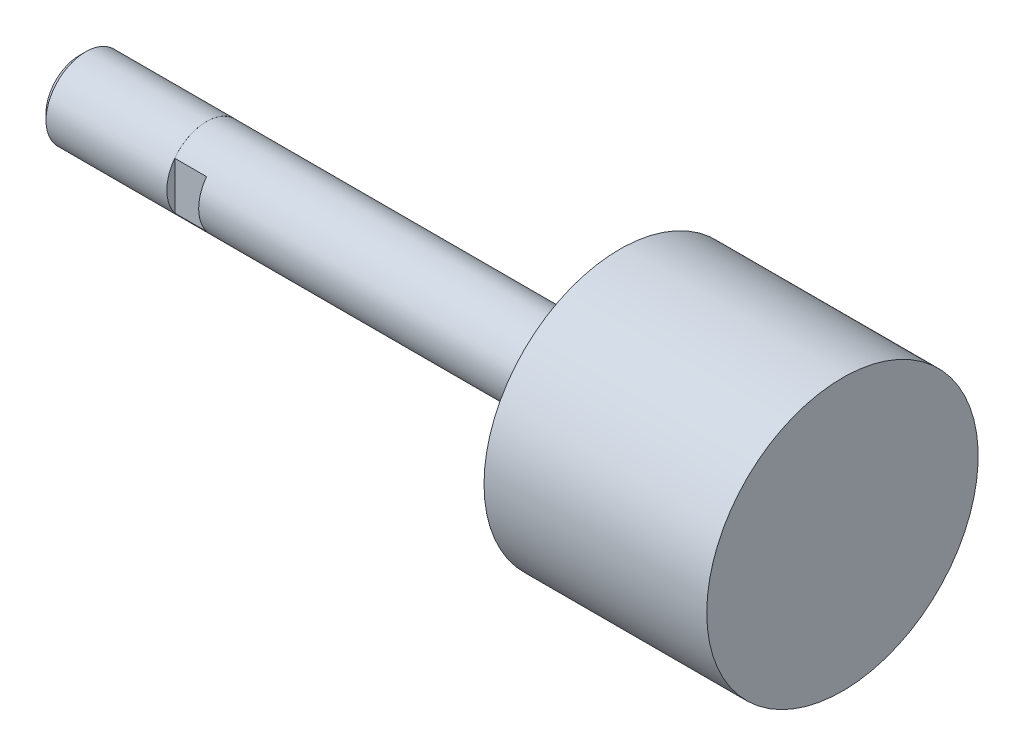
ISO-10303-21;
HEADER;
FILE_DESCRIPTION(('STEP AP214'),'2;1');
FILE_NAME('part.step','',(''),(''),'','','');
FILE_SCHEMA(('AUTOMOTIVE_DESIGN { 1 0 10303 214 1 1 1 1 }'));
ENDSEC;
DATA;
#1=APPLICATION_CONTEXT('core data for automotive mechanical design processes');
#2=APPLICATION_PROTOCOL_DEFINITION('international standard','automotive_design',2000,#1);
#3=PRODUCT_CONTEXT('',#1,'mechanical');
#4=PRODUCT('Part','Part','',(#3));
#5=PRODUCT_RELATED_PRODUCT_CATEGORY('part','',(#4));
#6=PRODUCT_DEFINITION_FORMATION('','',#4);
#7=PRODUCT_DEFINITION_CONTEXT('part definition',#1,'design');
#8=PRODUCT_DEFINITION('design','',#6,#7);
#9=PRODUCT_DEFINITION_SHAPE('','',#8);
#10=(LENGTH_UNIT() NAMED_UNIT(*) SI_UNIT(.MILLI.,.METRE.));
#11=(NAMED_UNIT(*) PLANE_ANGLE_UNIT() SI_UNIT($,.RADIAN.));
#12=(NAMED_UNIT(*) SI_UNIT($,.STERADIAN.) SOLID_ANGLE_UNIT());
#13=UNCERTAINTY_MEASURE_WITH_UNIT(LENGTH_MEASURE(1.E-05),#10,'distance_accuracy_value','');
#14=(GEOMETRIC_REPRESENTATION_CONTEXT(3) GLOBAL_UNCERTAINTY_ASSIGNED_CONTEXT((#13)) GLOBAL_UNIT_ASSIGNED_CONTEXT((#10,
#11,#12)) REPRESENTATION_CONTEXT('',''));
#15=CARTESIAN_POINT('',(0.,0.,0.));
#16=DIRECTION('',(0.,0.,1.));
#17=DIRECTION('',(1.,0.,0.));
#18=AXIS2_PLACEMENT_3D('',#15,#16,#17);
#19=CARTESIAN_POINT('',(-15.875,0.,0.));
#20=DIRECTION('',(1.,0.,0.));
#21=DIRECTION('',(0.,0.,-1.));
#22=AXIS2_PLACEMENT_3D('',#19,#20,#21);
#23=PLANE('',#22);
#24=CARTESIAN_POINT('',(-15.8749999999941,0.,0.));
#25=DIRECTION('',(1.,0.,0.));
#26=DIRECTION('',(0.,1.,0.));
#27=AXIS2_PLACEMENT_3D('',#24,#25,#26);
#28=CIRCLE('',#27,3.33883000007518);
#29=CARTESIAN_POINT('',(-15.8749999999941,3.33883000007518,0.));
#30=VERTEX_POINT('',#29);
#31=EDGE_CURVE('E19',#30,#30,#28,.T.);
#32=ORIENTED_EDGE('',*,*,#31,.F.);
#33=EDGE_LOOP('',(#32));
#34=FACE_BOUND('',#33,.T.);
#35=ADVANCED_FACE('F16',(#34),#23,.F.);
#36=CARTESIAN_POINT('',(-15.2450799999997,0.,0.));
#37=DIRECTION('',(1.,0.,0.));
#38=DIRECTION('',(0.,1.,0.));
#39=AXIS2_PLACEMENT_3D('',#36,#37,#38);
#40=CONICAL_SURFACE('',#39,3.96875000006958,0.785398163397448);
#41=ORIENTED_EDGE('',*,*,#31,.T.);
#42=EDGE_LOOP('',(#41));
#43=FACE_BOUND('',#42,.T.);
#44=CARTESIAN_POINT('',(-15.24508,0.,0.));
#45=DIRECTION('',(-1.,0.,0.));
#46=DIRECTION('',(0.,0.,1.));
#47=AXIS2_PLACEMENT_3D('',#44,#45,#46);
#48=CIRCLE('',#47,3.96875);
#49=CARTESIAN_POINT('',(-15.24508,0.,3.96875));
#50=VERTEX_POINT('',#49);
#51=EDGE_CURVE('E94',#50,#50,#48,.F.);
#52=ORIENTED_EDGE('',*,*,#51,.F.);
#53=EDGE_LOOP('',(#52));
#54=FACE_BOUND('',#53,.T.);
#55=ADVANCED_FACE('F221',(#43,#54),#40,.T.);
#56=CARTESIAN_POINT('',(-3.175,0.,0.));
#57=DIRECTION('',(-1.,0.,0.));
#58=DIRECTION('',(0.,0.,1.));
#59=AXIS2_PLACEMENT_3D('',#56,#57,#58);
#60=CYLINDRICAL_SURFACE('',#59,3.96875);
#61=ORIENTED_EDGE('',*,*,#51,.T.);
#62=EDGE_LOOP('',(#61));
#63=FACE_BOUND('',#62,.T.);
#64=CARTESIAN_POINT('',(-3.175,0.,0.));
#65=DIRECTION('',(-1.,0.,0.));
#66=DIRECTION('',(0.,0.,1.));
#67=AXIS2_PLACEMENT_3D('',#64,#65,#66);
#68=CIRCLE('',#67,3.96875);
#69=CARTESIAN_POINT('',(-3.175,0.,3.96875));
#70=VERTEX_POINT('',#69);
#71=EDGE_CURVE('E64',#70,#70,#68,.T.);
#72=ORIENTED_EDGE('',*,*,#71,.T.);
#73=EDGE_LOOP('',(#72));
#74=FACE_BOUND('',#73,.T.);
#75=ADVANCED_FACE('F211',(#63,#74),#60,.T.);
#76=CARTESIAN_POINT('',(0.,0.,0.));
#77=DIRECTION('',(1.,0.,0.));
#78=DIRECTION('',(0.,0.,-1.));
#79=AXIS2_PLACEMENT_3D('',#76,#77,#78);
#80=PLANE('',#79);
#81=CARTESIAN_POINT('',(0.,0.,0.));
#82=DIRECTION('',(-1.,0.,0.));
#83=DIRECTION('',(0.,0.,1.));
#84=AXIS2_PLACEMENT_3D('',#81,#82,#83);
#85=CIRCLE('',#84,3.9624);
#86=CARTESIAN_POINT('',(0.,2.37065154757083,3.175));
#87=VERTEX_POINT('',#86);
#88=CARTESIAN_POINT('',(0.,-2.37065154757084,3.175));
#89=VERTEX_POINT('',#88);
#90=EDGE_CURVE('E73',#87,#89,#85,.F.);
#91=ORIENTED_EDGE('',*,*,#90,.F.);
#92=DIRECTION('',(0.,1.,0.));
#93=VECTOR('',#92,1.);
#94=CARTESIAN_POINT('',(0.,3.9624,3.175));
#95=LINE('',#94,#93);
#96=EDGE_CURVE('E65',#87,#89,#95,.F.);
#97=ORIENTED_EDGE('',*,*,#96,.T.);
#98=EDGE_LOOP('',(#91,#97));
#99=FACE_BOUND('',#98,.T.);
#100=ADVANCED_FACE('F202',(#99),#80,.F.);
#101=CARTESIAN_POINT('',(0.,3.9624,3.175));
#102=DIRECTION('',(0.,0.,-1.));
#103=DIRECTION('',(-1.,0.,0.));
#104=AXIS2_PLACEMENT_3D('',#101,#102,#103);
#105=PLANE('',#104);
#106=DIRECTION('',(-1.,0.,0.));
#107=VECTOR('',#106,1.);
#108=CARTESIAN_POINT('',(60.3504,-2.37065154757084,3.175));
#109=LINE('',#108,#107);
#110=CARTESIAN_POINT('',(-3.175,-2.37065154757084,3.175));
#111=VERTEX_POINT('',#110);
#112=EDGE_CURVE('E92',#89,#111,#109,.T.);
#113=ORIENTED_EDGE('',*,*,#112,.F.);
#114=ORIENTED_EDGE('',*,*,#96,.F.);
#115=DIRECTION('',(-1.,0.,0.));
#116=VECTOR('',#115,1.);
#117=CARTESIAN_POINT('',(60.3504,2.37065154757083,3.175));
#118=LINE('',#117,#116);
#119=CARTESIAN_POINT('',(-3.175,2.37065154757083,3.175));
#120=VERTEX_POINT('',#119);
#121=EDGE_CURVE('E68',#120,#87,#118,.F.);
#122=ORIENTED_EDGE('',*,*,#121,.F.);
#123=DIRECTION('',(0.,1.,0.));
#124=VECTOR('',#123,1.);
#125=CARTESIAN_POINT('',(-3.175,3.96875,3.175));
#126=LINE('',#125,#124);
#127=EDGE_CURVE('E56',#120,#111,#126,.F.);
#128=ORIENTED_EDGE('',*,*,#127,.T.);
#129=EDGE_LOOP('',(#113,#114,#122,#128));
#130=FACE_BOUND('',#129,.T.);
#131=ADVANCED_FACE('F69',(#130),#105,.F.);
#132=CARTESIAN_POINT('',(-3.175,3.96875,0.));
#133=DIRECTION('',(-1.,0.,0.));
#134=DIRECTION('',(0.,0.,1.));
#135=AXIS2_PLACEMENT_3D('',#132,#133,#134);
#136=PLANE('',#135);
#137=ORIENTED_EDGE('',*,*,#71,.F.);
#138=EDGE_LOOP('',(#137));
#139=FACE_BOUND('',#138,.T.);
#140=DIRECTION('',(0.,1.,0.));
#141=VECTOR('',#140,1.);
#142=CARTESIAN_POINT('',(-3.175,-3.9624,-3.175));
#143=LINE('',#142,#141);
#144=CARTESIAN_POINT('',(-3.175,2.37065154757084,-3.175));
#145=VERTEX_POINT('',#144);
#146=CARTESIAN_POINT('',(-3.175,-2.37065154757083,-3.175));
#147=VERTEX_POINT('',#146);
#148=EDGE_CURVE('E80',#145,#147,#143,.F.);
#149=ORIENTED_EDGE('',*,*,#148,.T.);
#150=CARTESIAN_POINT('',(-3.175,0.,0.));
#151=DIRECTION('',(-1.,0.,0.));
#152=DIRECTION('',(0.,0.,1.));
#153=AXIS2_PLACEMENT_3D('',#150,#151,#152);
#154=CIRCLE('',#153,3.9624);
#155=EDGE_CURVE('E60',#111,#147,#154,.F.);
#156=ORIENTED_EDGE('',*,*,#155,.F.);
#157=ORIENTED_EDGE('',*,*,#127,.F.);
#158=CARTESIAN_POINT('',(-3.175,0.,0.));
#159=DIRECTION('',(-1.,0.,0.));
#160=DIRECTION('',(0.,0.,1.));
#161=AXIS2_PLACEMENT_3D('',#158,#159,#160);
#162=CIRCLE('',#161,3.9624);
#163=EDGE_CURVE('E53',#145,#120,#162,.F.);
#164=ORIENTED_EDGE('',*,*,#163,.F.);
#165=EDGE_LOOP('',(#149,#156,#157,#164));
#166=FACE_BOUND('',#165,.T.);
#167=ADVANCED_FACE('F58',(#139,#166),#136,.F.);
#168=CARTESIAN_POINT('',(0.,0.,0.));
#169=DIRECTION('',(1.,0.,0.));
#170=DIRECTION('',(0.,0.,-1.));
#171=AXIS2_PLACEMENT_3D('',#168,#169,#170);
#172=PLANE('',#171);
#173=CARTESIAN_POINT('',(0.,0.,0.));
#174=DIRECTION('',(-1.,0.,0.));
#175=DIRECTION('',(0.,0.,1.));
#176=AXIS2_PLACEMENT_3D('',#173,#174,#175);
#177=CIRCLE('',#176,3.9624);
#178=CARTESIAN_POINT('',(0.,-2.37065154757083,-3.175));
#179=VERTEX_POINT('',#178);
#180=CARTESIAN_POINT('',(0.,2.37065154757084,-3.175));
#181=VERTEX_POINT('',#180);
#182=EDGE_CURVE('E105',#179,#181,#177,.F.);
#183=ORIENTED_EDGE('',*,*,#182,.F.);
#184=DIRECTION('',(0.,1.,0.));
#185=VECTOR('',#184,1.);
#186=CARTESIAN_POINT('',(0.,-3.9624,-3.175));
#187=LINE('',#186,#185);
#188=EDGE_CURVE('E33',#179,#181,#187,.T.);
#189=ORIENTED_EDGE('',*,*,#188,.T.);
#190=EDGE_LOOP('',(#183,#189));
#191=FACE_BOUND('',#190,.T.);
#192=ADVANCED_FACE('F111',(#191),#172,.F.);
#193=CARTESIAN_POINT('',(0.,-3.9624,-3.175));
#194=DIRECTION('',(0.,0.,1.));
#195=DIRECTION('',(1.,0.,0.));
#196=AXIS2_PLACEMENT_3D('',#193,#194,#195);
#197=PLANE('',#196);
#198=DIRECTION('',(-1.,0.,0.));
#199=VECTOR('',#198,1.);
#200=CARTESIAN_POINT('',(60.3504,2.37065154757084,-3.175));
#201=LINE('',#200,#199);
#202=EDGE_CURVE('E79',#181,#145,#201,.T.);
#203=ORIENTED_EDGE('',*,*,#202,.F.);
#204=ORIENTED_EDGE('',*,*,#188,.F.);
#205=DIRECTION('',(-1.,0.,0.));
#206=VECTOR('',#205,1.);
#207=CARTESIAN_POINT('',(60.3504,-2.37065154757083,-3.175));
#208=LINE('',#207,#206);
#209=EDGE_CURVE('E106',#147,#179,#208,.F.);
#210=ORIENTED_EDGE('',*,*,#209,.F.);
#211=ORIENTED_EDGE('',*,*,#148,.F.);
#212=EDGE_LOOP('',(#203,#204,#210,#211));
#213=FACE_BOUND('',#212,.T.);
#214=ADVANCED_FACE('F110',(#213),#197,.F.);
#215=CARTESIAN_POINT('',(60.3504,0.,0.));
#216=DIRECTION('',(-1.,0.,0.));
#217=DIRECTION('',(0.,0.,1.));
#218=AXIS2_PLACEMENT_3D('',#215,#216,#217);
#219=CYLINDRICAL_SURFACE('',#218,3.9624);
#220=ORIENTED_EDGE('',*,*,#182,.T.);
#221=ORIENTED_EDGE('',*,*,#202,.T.);
#222=ORIENTED_EDGE('',*,*,#163,.T.);
#223=ORIENTED_EDGE('',*,*,#121,.T.);
#224=ORIENTED_EDGE('',*,*,#90,.T.);
#225=ORIENTED_EDGE('',*,*,#112,.T.);
#226=ORIENTED_EDGE('',*,*,#155,.T.);
#227=ORIENTED_EDGE('',*,*,#209,.T.);
#228=EDGE_LOOP('',(#220,#221,#222,#223,#224,#225,#226,#227));
#229=FACE_BOUND('',#228,.T.);
#230=CARTESIAN_POINT('',(38.1,0.,0.));
#231=DIRECTION('',(-1.,0.,0.));
#232=DIRECTION('',(0.,0.,1.));
#233=AXIS2_PLACEMENT_3D('',#230,#231,#232);
#234=CIRCLE('',#233,3.9624);
#235=CARTESIAN_POINT('',(38.1,0.,3.9624));
#236=VERTEX_POINT('',#235);
#237=EDGE_CURVE('E102',#236,#236,#234,.T.);
#238=ORIENTED_EDGE('',*,*,#237,.T.);
#239=EDGE_LOOP('',(#238));
#240=FACE_BOUND('',#239,.T.);
#241=ADVANCED_FACE('F77',(#229,#240),#219,.T.);
#242=CARTESIAN_POINT('',(60.3504,13.55725,0.));
#243=DIRECTION('',(-1.,0.,0.));
#244=DIRECTION('',(0.,0.,1.));
#245=AXIS2_PLACEMENT_3D('',#242,#243,#244);
#246=PLANE('',#245);
#247=CARTESIAN_POINT('',(60.3504,0.,0.));
#248=DIRECTION('',(-1.,0.,0.));
#249=DIRECTION('',(0.,0.,1.));
#250=AXIS2_PLACEMENT_3D('',#247,#248,#249);
#251=CIRCLE('',#250,13.55725);
#252=CARTESIAN_POINT('',(60.3504,0.,13.55725));
#253=VERTEX_POINT('',#252);
#254=EDGE_CURVE('E25',#253,#253,#251,.T.);
#255=ORIENTED_EDGE('',*,*,#254,.F.);
#256=EDGE_LOOP('',(#255));
#257=FACE_BOUND('',#256,.T.);
#258=ADVANCED_FACE('F130',(#257),#246,.F.);
#259=CARTESIAN_POINT('',(38.1,3.9624,0.));
#260=DIRECTION('',(1.,0.,0.));
#261=DIRECTION('',(0.,0.,-1.));
#262=AXIS2_PLACEMENT_3D('',#259,#260,#261);
#263=PLANE('',#262);
#264=ORIENTED_EDGE('',*,*,#237,.F.);
#265=EDGE_LOOP('',(#264));
#266=FACE_BOUND('',#265,.T.);
#267=CARTESIAN_POINT('',(38.1,0.,0.));
#268=DIRECTION('',(-1.,0.,0.));
#269=DIRECTION('',(0.,0.,1.));
#270=AXIS2_PLACEMENT_3D('',#267,#268,#269);
#271=CIRCLE('',#270,13.55725);
#272=CARTESIAN_POINT('',(38.1,0.,13.55725));
#273=VERTEX_POINT('',#272);
#274=EDGE_CURVE('E10',#273,#273,#271,.F.);
#275=ORIENTED_EDGE('',*,*,#274,.F.);
#276=EDGE_LOOP('',(#275));
#277=FACE_BOUND('',#276,.T.);
#278=ADVANCED_FACE('F124',(#266,#277),#263,.F.);
#279=CARTESIAN_POINT('',(60.3504,0.,0.));
#280=DIRECTION('',(-1.,0.,0.));
#281=DIRECTION('',(0.,0.,1.));
#282=AXIS2_PLACEMENT_3D('',#279,#280,#281);
#283=CYLINDRICAL_SURFACE('',#282,13.55725);
#284=ORIENTED_EDGE('',*,*,#274,.T.);
#285=EDGE_LOOP('',(#284));
#286=FACE_BOUND('',#285,.T.);
#287=ORIENTED_EDGE('',*,*,#254,.T.);
#288=EDGE_LOOP('',(#287));
#289=FACE_BOUND('',#288,.T.);
#290=ADVANCED_FACE('F122',(#286,#289),#283,.T.);
#291=CLOSED_SHELL('',(#35,#55,#75,#100,#131,#167,#192,#214,#241,#258,#278,#290));
#292=MANIFOLD_SOLID_BREP('B1',#291);
#293=ADVANCED_BREP_SHAPE_REPRESENTATION('',(#18,#292),#14);
#294=SHAPE_DEFINITION_REPRESENTATION(#9,#293);
ENDSEC;
END-ISO-10303-21;
